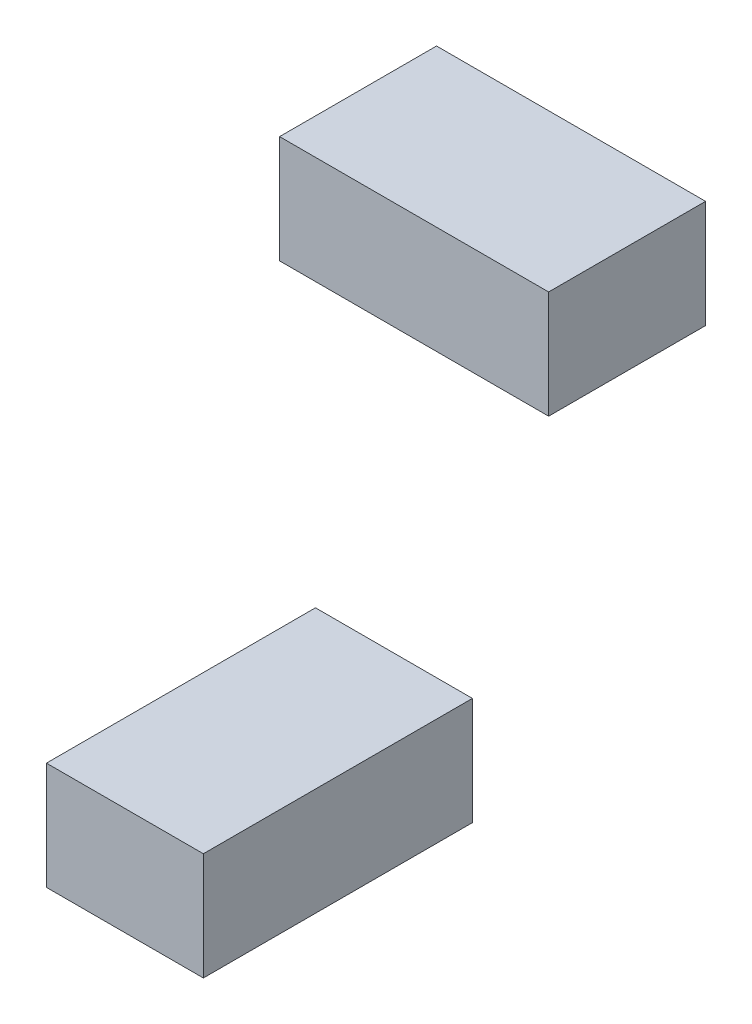
ISO-10303-21;
HEADER;
FILE_DESCRIPTION(('STEP AP214'),'2;1');
FILE_NAME('part.step','',(''),(''),'','','');
FILE_SCHEMA(('AUTOMOTIVE_DESIGN { 1 0 10303 214 1 1 1 1 }'));
ENDSEC;
DATA;
#1=APPLICATION_CONTEXT('core data for automotive mechanical design processes');
#2=APPLICATION_PROTOCOL_DEFINITION('international standard','automotive_design',2000,#1);
#3=PRODUCT_CONTEXT('',#1,'mechanical');
#4=PRODUCT('Part','Part','',(#3));
#5=PRODUCT_RELATED_PRODUCT_CATEGORY('part','',(#4));
#6=PRODUCT_DEFINITION_FORMATION('','',#4);
#7=PRODUCT_DEFINITION_CONTEXT('part definition',#1,'design');
#8=PRODUCT_DEFINITION('design','',#6,#7);
#9=PRODUCT_DEFINITION_SHAPE('','',#8);
#10=(LENGTH_UNIT() NAMED_UNIT(*) SI_UNIT(.MILLI.,.METRE.));
#11=(NAMED_UNIT(*) PLANE_ANGLE_UNIT() SI_UNIT($,.RADIAN.));
#12=(NAMED_UNIT(*) SI_UNIT($,.STERADIAN.) SOLID_ANGLE_UNIT());
#13=UNCERTAINTY_MEASURE_WITH_UNIT(LENGTH_MEASURE(1.E-05),#10,'distance_accuracy_value','');
#14=(GEOMETRIC_REPRESENTATION_CONTEXT(3) GLOBAL_UNCERTAINTY_ASSIGNED_CONTEXT((#13)) GLOBAL_UNIT_ASSIGNED_CONTEXT((#10,
#11,#12)) REPRESENTATION_CONTEXT('',''));
#15=CARTESIAN_POINT('',(0.,0.,0.));
#16=DIRECTION('',(0.,0.,1.));
#17=DIRECTION('',(1.,0.,0.));
#18=AXIS2_PLACEMENT_3D('',#15,#16,#17);
#19=CARTESIAN_POINT('',(-5.715,0.6096,-17.7546));
#20=DIRECTION('',(-1.,0.,0.));
#21=DIRECTION('',(0.,0.,1.));
#22=AXIS2_PLACEMENT_3D('',#19,#20,#21);
#23=PLANE('',#22);
#24=DIRECTION('',(0.,0.,-1.));
#25=VECTOR('',#24,1.);
#26=CARTESIAN_POINT('',(-5.715,0.,-17.7546));
#27=LINE('',#26,#25);
#28=CARTESIAN_POINT('',(-5.715,0.,-17.7546));
#29=VERTEX_POINT('',#28);
#30=CARTESIAN_POINT('',(-5.715,0.,-18.6436));
#31=VERTEX_POINT('',#30);
#32=EDGE_CURVE('E107',#29,#31,#27,.T.);
#33=ORIENTED_EDGE('',*,*,#32,.T.);
#34=DIRECTION('',(0.,-1.,0.));
#35=VECTOR('',#34,1.);
#36=CARTESIAN_POINT('',(-5.715,0.6096,-18.6436));
#37=LINE('',#36,#35);
#38=CARTESIAN_POINT('',(-5.715,0.6096,-18.6436));
#39=VERTEX_POINT('',#38);
#40=EDGE_CURVE('E12',#39,#31,#37,.T.);
#41=ORIENTED_EDGE('',*,*,#40,.F.);
#42=DIRECTION('',(0.,0.,-1.));
#43=VECTOR('',#42,1.);
#44=CARTESIAN_POINT('',(-5.715,0.6096,-17.7546));
#45=LINE('',#44,#43);
#46=CARTESIAN_POINT('',(-5.715,0.6096,-17.7546));
#47=VERTEX_POINT('',#46);
#48=EDGE_CURVE('E95',#47,#39,#45,.T.);
#49=ORIENTED_EDGE('',*,*,#48,.F.);
#50=DIRECTION('',(0.,-1.,0.));
#51=VECTOR('',#50,1.);
#52=CARTESIAN_POINT('',(-5.715,0.6096,-17.7546));
#53=LINE('',#52,#51);
#54=EDGE_CURVE('E103',#47,#29,#53,.T.);
#55=ORIENTED_EDGE('',*,*,#54,.T.);
#56=EDGE_LOOP('',(#33,#41,#49,#55));
#57=FACE_BOUND('',#56,.T.);
#58=ADVANCED_FACE('F44',(#57),#23,.F.);
#59=CARTESIAN_POINT('',(-5.715,0.6096,-18.6436));
#60=DIRECTION('',(0.,0.,1.));
#61=DIRECTION('',(1.,0.,0.));
#62=AXIS2_PLACEMENT_3D('',#59,#60,#61);
#63=PLANE('',#62);
#64=DIRECTION('',(-1.,0.,0.));
#65=VECTOR('',#64,1.);
#66=CARTESIAN_POINT('',(-5.715,0.,-18.6436));
#67=LINE('',#66,#65);
#68=CARTESIAN_POINT('',(-7.23900000000001,0.,-18.6436));
#69=VERTEX_POINT('',#68);
#70=EDGE_CURVE('E99',#31,#69,#67,.T.);
#71=ORIENTED_EDGE('',*,*,#70,.T.);
#72=DIRECTION('',(0.,-1.,0.));
#73=VECTOR('',#72,1.);
#74=CARTESIAN_POINT('',(-7.23900000000001,0.6096,-18.6436));
#75=LINE('',#74,#73);
#76=CARTESIAN_POINT('',(-7.23900000000001,0.6096,-18.6436));
#77=VERTEX_POINT('',#76);
#78=EDGE_CURVE('E52',#77,#69,#75,.T.);
#79=ORIENTED_EDGE('',*,*,#78,.F.);
#80=DIRECTION('',(-1.,0.,0.));
#81=VECTOR('',#80,1.);
#82=CARTESIAN_POINT('',(-5.715,0.6096,-18.6436));
#83=LINE('',#82,#81);
#84=EDGE_CURVE('E90',#39,#77,#83,.T.);
#85=ORIENTED_EDGE('',*,*,#84,.F.);
#86=ORIENTED_EDGE('',*,*,#40,.T.);
#87=EDGE_LOOP('',(#71,#79,#85,#86));
#88=FACE_BOUND('',#87,.T.);
#89=ADVANCED_FACE('F98',(#88),#63,.F.);
#90=CARTESIAN_POINT('',(-7.23900000000001,0.6096,-17.7546));
#91=DIRECTION('',(1.,0.,0.));
#92=DIRECTION('',(0.,0.,-1.));
#93=AXIS2_PLACEMENT_3D('',#90,#91,#92);
#94=PLANE('',#93);
#95=DIRECTION('',(0.,0.,1.));
#96=VECTOR('',#95,1.);
#97=CARTESIAN_POINT('',(-7.23900000000001,0.,-17.7546));
#98=LINE('',#97,#96);
#99=CARTESIAN_POINT('',(-7.23900000000001,0.,-17.7546));
#100=VERTEX_POINT('',#99);
#101=EDGE_CURVE('E77',#69,#100,#98,.T.);
#102=ORIENTED_EDGE('',*,*,#101,.T.);
#103=DIRECTION('',(0.,-1.,0.));
#104=VECTOR('',#103,1.);
#105=CARTESIAN_POINT('',(-7.23900000000001,0.6096,-17.7546));
#106=LINE('',#105,#104);
#107=CARTESIAN_POINT('',(-7.23900000000001,0.6096,-17.7546));
#108=VERTEX_POINT('',#107);
#109=EDGE_CURVE('E100',#108,#100,#106,.T.);
#110=ORIENTED_EDGE('',*,*,#109,.F.);
#111=DIRECTION('',(0.,0.,1.));
#112=VECTOR('',#111,1.);
#113=CARTESIAN_POINT('',(-7.23900000000001,0.6096,-17.7546));
#114=LINE('',#113,#112);
#115=EDGE_CURVE('E93',#77,#108,#114,.T.);
#116=ORIENTED_EDGE('',*,*,#115,.F.);
#117=ORIENTED_EDGE('',*,*,#78,.T.);
#118=EDGE_LOOP('',(#102,#110,#116,#117));
#119=FACE_BOUND('',#118,.T.);
#120=ADVANCED_FACE('F101',(#119),#94,.F.);
#121=CARTESIAN_POINT('',(-5.715,0.6096,-17.7546));
#122=DIRECTION('',(0.,0.,-1.));
#123=DIRECTION('',(-1.,0.,0.));
#124=AXIS2_PLACEMENT_3D('',#121,#122,#123);
#125=PLANE('',#124);
#126=DIRECTION('',(1.,0.,0.));
#127=VECTOR('',#126,1.);
#128=CARTESIAN_POINT('',(-5.715,0.,-17.7546));
#129=LINE('',#128,#127);
#130=EDGE_CURVE('E83',#100,#29,#129,.T.);
#131=ORIENTED_EDGE('',*,*,#130,.T.);
#132=ORIENTED_EDGE('',*,*,#54,.F.);
#133=DIRECTION('',(1.,0.,0.));
#134=VECTOR('',#133,1.);
#135=CARTESIAN_POINT('',(-5.715,0.6096,-17.7546));
#136=LINE('',#135,#134);
#137=EDGE_CURVE('E60',#108,#47,#136,.T.);
#138=ORIENTED_EDGE('',*,*,#137,.F.);
#139=ORIENTED_EDGE('',*,*,#109,.T.);
#140=EDGE_LOOP('',(#131,#132,#138,#139));
#141=FACE_BOUND('',#140,.T.);
#142=ADVANCED_FACE('F114',(#141),#125,.F.);
#143=CARTESIAN_POINT('',(0.,0.6096,0.));
#144=DIRECTION('',(0.,1.,0.));
#145=DIRECTION('',(0.,0.,1.));
#146=AXIS2_PLACEMENT_3D('',#143,#144,#145);
#147=PLANE('',#146);
#148=ORIENTED_EDGE('',*,*,#48,.T.);
#149=ORIENTED_EDGE('',*,*,#84,.T.);
#150=ORIENTED_EDGE('',*,*,#115,.T.);
#151=ORIENTED_EDGE('',*,*,#137,.T.);
#152=EDGE_LOOP('',(#148,#149,#150,#151));
#153=FACE_BOUND('',#152,.T.);
#154=ADVANCED_FACE('F91',(#153),#147,.T.);
#155=CARTESIAN_POINT('',(0.,0.,0.));
#156=DIRECTION('',(0.,1.,0.));
#157=DIRECTION('',(0.,0.,1.));
#158=AXIS2_PLACEMENT_3D('',#155,#156,#157);
#159=PLANE('',#158);
#160=ORIENTED_EDGE('',*,*,#32,.F.);
#161=ORIENTED_EDGE('',*,*,#130,.F.);
#162=ORIENTED_EDGE('',*,*,#101,.F.);
#163=ORIENTED_EDGE('',*,*,#70,.F.);
#164=EDGE_LOOP('',(#160,#161,#162,#163));
#165=FACE_BOUND('',#164,.T.);
#166=ADVANCED_FACE('F117',(#165),#159,.F.);
#167=CLOSED_SHELL('',(#58,#89,#120,#142,#154,#166));
#168=MANIFOLD_SOLID_BREP('B2',#167);
#169=CARTESIAN_POINT('',(-3.937,0.6096,-15.5448));
#170=DIRECTION('',(-1.,0.,0.));
#171=DIRECTION('',(0.,0.,1.));
#172=AXIS2_PLACEMENT_3D('',#169,#170,#171);
#173=PLANE('',#172);
#174=DIRECTION('',(0.,0.,-1.));
#175=VECTOR('',#174,1.);
#176=CARTESIAN_POINT('',(-3.937,0.,-15.5448));
#177=LINE('',#176,#175);
#178=CARTESIAN_POINT('',(-3.937,0.,-14.0208));
#179=VERTEX_POINT('',#178);
#180=CARTESIAN_POINT('',(-3.937,0.,-15.5448));
#181=VERTEX_POINT('',#180);
#182=EDGE_CURVE('E230',#179,#181,#177,.T.);
#183=ORIENTED_EDGE('',*,*,#182,.T.);
#184=DIRECTION('',(0.,-1.,0.));
#185=VECTOR('',#184,1.);
#186=CARTESIAN_POINT('',(-3.937,0.6096,-15.5448));
#187=LINE('',#186,#185);
#188=CARTESIAN_POINT('',(-3.937,0.6096,-15.5448));
#189=VERTEX_POINT('',#188);
#190=EDGE_CURVE('E42',#189,#181,#187,.T.);
#191=ORIENTED_EDGE('',*,*,#190,.F.);
#192=DIRECTION('',(0.,0.,-1.));
#193=VECTOR('',#192,1.);
#194=CARTESIAN_POINT('',(-3.937,0.6096,-15.5448));
#195=LINE('',#194,#193);
#196=CARTESIAN_POINT('',(-3.937,0.6096,-14.0208));
#197=VERTEX_POINT('',#196);
#198=EDGE_CURVE('E218',#197,#189,#195,.T.);
#199=ORIENTED_EDGE('',*,*,#198,.F.);
#200=DIRECTION('',(0.,-1.,0.));
#201=VECTOR('',#200,1.);
#202=CARTESIAN_POINT('',(-3.937,0.6096,-14.0208));
#203=LINE('',#202,#201);
#204=EDGE_CURVE('E226',#197,#179,#203,.T.);
#205=ORIENTED_EDGE('',*,*,#204,.T.);
#206=EDGE_LOOP('',(#183,#191,#199,#205));
#207=FACE_BOUND('',#206,.T.);
#208=ADVANCED_FACE('F167',(#207),#173,.F.);
#209=CARTESIAN_POINT('',(-3.937,0.6096,-15.5448));
#210=DIRECTION('',(0.,0.,1.));
#211=DIRECTION('',(1.,0.,0.));
#212=AXIS2_PLACEMENT_3D('',#209,#210,#211);
#213=PLANE('',#212);
#214=DIRECTION('',(-1.,0.,0.));
#215=VECTOR('',#214,1.);
#216=CARTESIAN_POINT('',(-3.937,0.,-15.5448));
#217=LINE('',#216,#215);
#218=CARTESIAN_POINT('',(-4.82600000000001,0.,-15.5448));
#219=VERTEX_POINT('',#218);
#220=EDGE_CURVE('E222',#181,#219,#217,.T.);
#221=ORIENTED_EDGE('',*,*,#220,.T.);
#222=DIRECTION('',(0.,-1.,0.));
#223=VECTOR('',#222,1.);
#224=CARTESIAN_POINT('',(-4.82600000000001,0.6096,-15.5448));
#225=LINE('',#224,#223);
#226=CARTESIAN_POINT('',(-4.82600000000001,0.6096,-15.5448));
#227=VERTEX_POINT('',#226);
#228=EDGE_CURVE('E175',#227,#219,#225,.T.);
#229=ORIENTED_EDGE('',*,*,#228,.F.);
#230=DIRECTION('',(-1.,0.,0.));
#231=VECTOR('',#230,1.);
#232=CARTESIAN_POINT('',(-3.937,0.6096,-15.5448));
#233=LINE('',#232,#231);
#234=EDGE_CURVE('E213',#189,#227,#233,.T.);
#235=ORIENTED_EDGE('',*,*,#234,.F.);
#236=ORIENTED_EDGE('',*,*,#190,.T.);
#237=EDGE_LOOP('',(#221,#229,#235,#236));
#238=FACE_BOUND('',#237,.T.);
#239=ADVANCED_FACE('F221',(#238),#213,.F.);
#240=CARTESIAN_POINT('',(-4.82600000000001,0.6096,-15.5448));
#241=DIRECTION('',(1.,0.,0.));
#242=DIRECTION('',(0.,0.,-1.));
#243=AXIS2_PLACEMENT_3D('',#240,#241,#242);
#244=PLANE('',#243);
#245=DIRECTION('',(0.,0.,1.));
#246=VECTOR('',#245,1.);
#247=CARTESIAN_POINT('',(-4.82600000000001,0.,-15.5448));
#248=LINE('',#247,#246);
#249=CARTESIAN_POINT('',(-4.826,0.,-14.0208));
#250=VERTEX_POINT('',#249);
#251=EDGE_CURVE('E200',#219,#250,#248,.T.);
#252=ORIENTED_EDGE('',*,*,#251,.T.);
#253=DIRECTION('',(0.,-1.,0.));
#254=VECTOR('',#253,1.);
#255=CARTESIAN_POINT('',(-4.826,0.6096,-14.0208));
#256=LINE('',#255,#254);
#257=CARTESIAN_POINT('',(-4.826,0.6096,-14.0208));
#258=VERTEX_POINT('',#257);
#259=EDGE_CURVE('E223',#258,#250,#256,.T.);
#260=ORIENTED_EDGE('',*,*,#259,.F.);
#261=DIRECTION('',(0.,0.,1.));
#262=VECTOR('',#261,1.);
#263=CARTESIAN_POINT('',(-4.82600000000001,0.6096,-15.5448));
#264=LINE('',#263,#262);
#265=EDGE_CURVE('E216',#227,#258,#264,.T.);
#266=ORIENTED_EDGE('',*,*,#265,.F.);
#267=ORIENTED_EDGE('',*,*,#228,.T.);
#268=EDGE_LOOP('',(#252,#260,#266,#267));
#269=FACE_BOUND('',#268,.T.);
#270=ADVANCED_FACE('F224',(#269),#244,.F.);
#271=CARTESIAN_POINT('',(-3.937,0.6096,-14.0208));
#272=DIRECTION('',(0.,0.,-1.));
#273=DIRECTION('',(-1.,0.,0.));
#274=AXIS2_PLACEMENT_3D('',#271,#272,#273);
#275=PLANE('',#274);
#276=DIRECTION('',(1.,0.,0.));
#277=VECTOR('',#276,1.);
#278=CARTESIAN_POINT('',(-3.937,0.,-14.0208));
#279=LINE('',#278,#277);
#280=EDGE_CURVE('E206',#250,#179,#279,.T.);
#281=ORIENTED_EDGE('',*,*,#280,.T.);
#282=ORIENTED_EDGE('',*,*,#204,.F.);
#283=DIRECTION('',(1.,0.,0.));
#284=VECTOR('',#283,1.);
#285=CARTESIAN_POINT('',(-3.937,0.6096,-14.0208));
#286=LINE('',#285,#284);
#287=EDGE_CURVE('E183',#258,#197,#286,.T.);
#288=ORIENTED_EDGE('',*,*,#287,.F.);
#289=ORIENTED_EDGE('',*,*,#259,.T.);
#290=EDGE_LOOP('',(#281,#282,#288,#289));
#291=FACE_BOUND('',#290,.T.);
#292=ADVANCED_FACE('F237',(#291),#275,.F.);
#293=CARTESIAN_POINT('',(0.,0.6096,0.));
#294=DIRECTION('',(0.,-1.,0.));
#295=DIRECTION('',(0.,0.,-1.));
#296=AXIS2_PLACEMENT_3D('',#293,#294,#295);
#297=PLANE('',#296);
#298=ORIENTED_EDGE('',*,*,#198,.T.);
#299=ORIENTED_EDGE('',*,*,#234,.T.);
#300=ORIENTED_EDGE('',*,*,#265,.T.);
#301=ORIENTED_EDGE('',*,*,#287,.T.);
#302=EDGE_LOOP('',(#298,#299,#300,#301));
#303=FACE_BOUND('',#302,.T.);
#304=ADVANCED_FACE('F214',(#303),#297,.F.);
#305=CARTESIAN_POINT('',(0.,0.,0.));
#306=DIRECTION('',(0.,-1.,0.));
#307=DIRECTION('',(0.,0.,-1.));
#308=AXIS2_PLACEMENT_3D('',#305,#306,#307);
#309=PLANE('',#308);
#310=ORIENTED_EDGE('',*,*,#182,.F.);
#311=ORIENTED_EDGE('',*,*,#280,.F.);
#312=ORIENTED_EDGE('',*,*,#251,.F.);
#313=ORIENTED_EDGE('',*,*,#220,.F.);
#314=EDGE_LOOP('',(#310,#311,#312,#313));
#315=FACE_BOUND('',#314,.T.);
#316=ADVANCED_FACE('F240',(#315),#309,.T.);
#317=CLOSED_SHELL('',(#208,#239,#270,#292,#304,#316));
#318=MANIFOLD_SOLID_BREP('B6',#317);
#319=ADVANCED_BREP_SHAPE_REPRESENTATION('',(#18,#168,#318),#14);
#320=SHAPE_DEFINITION_REPRESENTATION(#9,#319);
ENDSEC;
END-ISO-10303-21;
